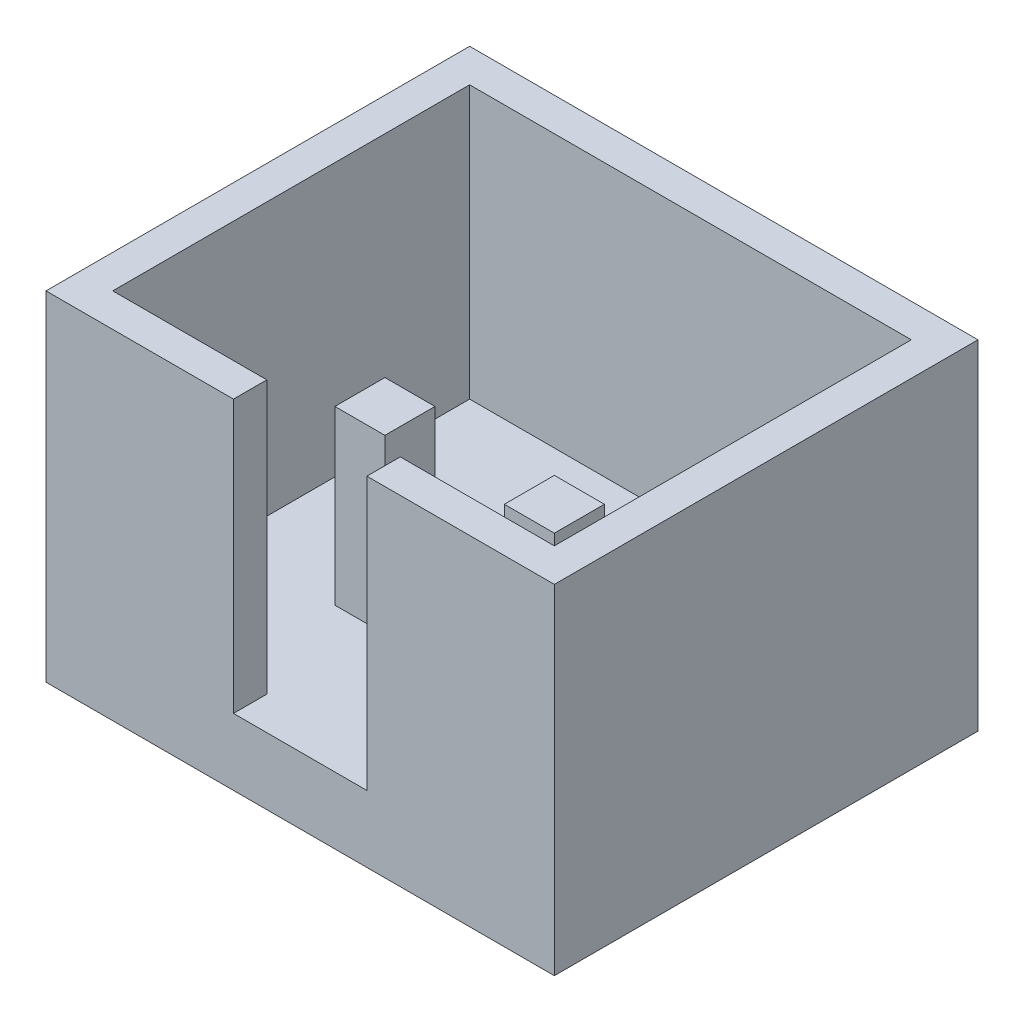
ISO-10303-21;
HEADER;
FILE_DESCRIPTION(('STEP AP214'),'2;1');
FILE_NAME('part.step','',(''),(''),'','','');
FILE_SCHEMA(('AUTOMOTIVE_DESIGN { 1 0 10303 214 1 1 1 1 }'));
ENDSEC;
DATA;
#1=APPLICATION_CONTEXT('core data for automotive mechanical design processes');
#2=APPLICATION_PROTOCOL_DEFINITION('international standard','automotive_design',2000,#1);
#3=PRODUCT_CONTEXT('',#1,'mechanical');
#4=PRODUCT('Part','Part','',(#3));
#5=PRODUCT_RELATED_PRODUCT_CATEGORY('part','',(#4));
#6=PRODUCT_DEFINITION_FORMATION('','',#4);
#7=PRODUCT_DEFINITION_CONTEXT('part definition',#1,'design');
#8=PRODUCT_DEFINITION('design','',#6,#7);
#9=PRODUCT_DEFINITION_SHAPE('','',#8);
#10=(LENGTH_UNIT() NAMED_UNIT(*) SI_UNIT(.MILLI.,.METRE.));
#11=(NAMED_UNIT(*) PLANE_ANGLE_UNIT() SI_UNIT($,.RADIAN.));
#12=(NAMED_UNIT(*) SI_UNIT($,.STERADIAN.) SOLID_ANGLE_UNIT());
#13=UNCERTAINTY_MEASURE_WITH_UNIT(LENGTH_MEASURE(1.E-05),#10,'distance_accuracy_value','');
#14=(GEOMETRIC_REPRESENTATION_CONTEXT(3) GLOBAL_UNCERTAINTY_ASSIGNED_CONTEXT((#13)) GLOBAL_UNIT_ASSIGNED_CONTEXT((#10,
#11,#12)) REPRESENTATION_CONTEXT('',''));
#15=CARTESIAN_POINT('',(0.,0.,0.));
#16=DIRECTION('',(0.,0.,1.));
#17=DIRECTION('',(1.,0.,0.));
#18=AXIS2_PLACEMENT_3D('',#15,#16,#17);
#19=CARTESIAN_POINT('',(-3.81,0.,3.175));
#20=DIRECTION('',(0.,1.,0.));
#21=DIRECTION('',(0.,0.,1.));
#22=AXIS2_PLACEMENT_3D('',#19,#20,#21);
#23=PLANE('',#22);
#24=DIRECTION('',(0.,0.,-1.));
#25=VECTOR('',#24,1.);
#26=CARTESIAN_POINT('',(-1.645,0.,3.175));
#27=LINE('',#26,#25);
#28=CARTESIAN_POINT('',(-1.645,0.,1.01));
#29=VERTEX_POINT('',#28);
#30=CARTESIAN_POINT('',(-1.645,0.,0.259999999999998));
#31=VERTEX_POINT('',#30);
#32=EDGE_CURVE('E321',#29,#31,#27,.T.);
#33=ORIENTED_EDGE('',*,*,#32,.F.);
#34=DIRECTION('',(-1.,0.,0.));
#35=VECTOR('',#34,1.);
#36=CARTESIAN_POINT('',(-3.81,0.,1.01));
#37=LINE('',#36,#35);
#38=CARTESIAN_POINT('',(-0.895,0.,1.01));
#39=VERTEX_POINT('',#38);
#40=EDGE_CURVE('E312',#39,#29,#37,.T.);
#41=ORIENTED_EDGE('',*,*,#40,.F.);
#42=DIRECTION('',(0.,0.,1.));
#43=VECTOR('',#42,1.);
#44=CARTESIAN_POINT('',(-0.894999999999996,0.,3.17499999999999));
#45=LINE('',#44,#43);
#46=CARTESIAN_POINT('',(-0.895000000000001,0.,0.259999999999998));
#47=VERTEX_POINT('',#46);
#48=EDGE_CURVE('E315',#47,#39,#45,.T.);
#49=ORIENTED_EDGE('',*,*,#48,.F.);
#50=DIRECTION('',(1.,0.,0.));
#51=VECTOR('',#50,1.);
#52=CARTESIAN_POINT('',(-3.81,0.,0.259999999999998));
#53=LINE('',#52,#51);
#54=EDGE_CURVE('E318',#31,#47,#53,.T.);
#55=ORIENTED_EDGE('',*,*,#54,.F.);
#56=EDGE_LOOP('',(#33,#41,#49,#55));
#57=FACE_BOUND('',#56,.T.);
#58=DIRECTION('',(0.,0.,1.));
#59=VECTOR('',#58,1.);
#60=CARTESIAN_POINT('',(-3.81,0.,-3.175));
#61=LINE('',#60,#59);
#62=CARTESIAN_POINT('',(-3.81,0.,-3.175));
#63=VERTEX_POINT('',#62);
#64=CARTESIAN_POINT('',(-3.81,0.,3.175));
#65=VERTEX_POINT('',#64);
#66=EDGE_CURVE('E379',#63,#65,#61,.T.);
#67=ORIENTED_EDGE('',*,*,#66,.F.);
#68=DIRECTION('',(-1.,0.,0.));
#69=VECTOR('',#68,1.);
#70=CARTESIAN_POINT('',(-3.81,0.,-3.175));
#71=LINE('',#70,#69);
#72=CARTESIAN_POINT('',(3.81,0.,-3.175));
#73=VERTEX_POINT('',#72);
#74=EDGE_CURVE('E386',#73,#63,#71,.T.);
#75=ORIENTED_EDGE('',*,*,#74,.F.);
#76=DIRECTION('',(0.,0.,-1.));
#77=VECTOR('',#76,1.);
#78=CARTESIAN_POINT('',(3.81,0.,-3.175));
#79=LINE('',#78,#77);
#80=CARTESIAN_POINT('',(3.81,0.,3.175));
#81=VERTEX_POINT('',#80);
#82=EDGE_CURVE('E384',#81,#73,#79,.T.);
#83=ORIENTED_EDGE('',*,*,#82,.F.);
#84=DIRECTION('',(1.,0.,0.));
#85=VECTOR('',#84,1.);
#86=CARTESIAN_POINT('',(-3.81,0.,3.175));
#87=LINE('',#86,#85);
#88=EDGE_CURVE('E382',#65,#81,#87,.T.);
#89=ORIENTED_EDGE('',*,*,#88,.F.);
#90=EDGE_LOOP('',(#67,#75,#83,#89));
#91=FACE_BOUND('',#90,.T.);
#92=DIRECTION('',(0.,0.,-1.));
#93=VECTOR('',#92,1.);
#94=CARTESIAN_POINT('',(0.895,0.,3.175));
#95=LINE('',#94,#93);
#96=CARTESIAN_POINT('',(0.895000000000001,0.,1.01));
#97=VERTEX_POINT('',#96);
#98=CARTESIAN_POINT('',(0.895000000000002,0.,0.259999999999998));
#99=VERTEX_POINT('',#98);
#100=EDGE_CURVE('E273',#97,#99,#95,.T.);
#101=ORIENTED_EDGE('',*,*,#100,.F.);
#102=DIRECTION('',(-1.,0.,0.));
#103=VECTOR('',#102,1.);
#104=CARTESIAN_POINT('',(-3.81,0.,1.01));
#105=LINE('',#104,#103);
#106=CARTESIAN_POINT('',(1.645,0.,1.01));
#107=VERTEX_POINT('',#106);
#108=EDGE_CURVE('E268',#107,#97,#105,.T.);
#109=ORIENTED_EDGE('',*,*,#108,.F.);
#110=DIRECTION('',(0.,0.,1.));
#111=VECTOR('',#110,1.);
#112=CARTESIAN_POINT('',(1.645,0.,3.17499999999999));
#113=LINE('',#112,#111);
#114=CARTESIAN_POINT('',(1.645,0.,0.259999999999998));
#115=VERTEX_POINT('',#114);
#116=EDGE_CURVE('E54',#115,#107,#113,.T.);
#117=ORIENTED_EDGE('',*,*,#116,.F.);
#118=DIRECTION('',(1.,0.,0.));
#119=VECTOR('',#118,1.);
#120=CARTESIAN_POINT('',(-3.81,0.,0.259999999999997));
#121=LINE('',#120,#119);
#122=EDGE_CURVE('E49',#99,#115,#121,.T.);
#123=ORIENTED_EDGE('',*,*,#122,.F.);
#124=EDGE_LOOP('',(#101,#109,#117,#123));
#125=FACE_BOUND('',#124,.T.);
#126=ADVANCED_FACE('F34',(#57,#91,#125),#23,.F.);
#127=CARTESIAN_POINT('',(-3.81,1.,3.175));
#128=DIRECTION('',(0.,1.,0.));
#129=DIRECTION('',(0.,0.,1.));
#130=AXIS2_PLACEMENT_3D('',#127,#128,#129);
#131=PLANE('',#130);
#132=DIRECTION('',(-1.,0.,0.));
#133=VECTOR('',#132,1.);
#134=CARTESIAN_POINT('',(-3.81,1.,1.01));
#135=LINE('',#134,#133);
#136=CARTESIAN_POINT('',(-0.895,1.,1.01));
#137=VERTEX_POINT('',#136);
#138=CARTESIAN_POINT('',(-1.645,1.,1.01));
#139=VERTEX_POINT('',#138);
#140=EDGE_CURVE('E411',#137,#139,#135,.T.);
#141=ORIENTED_EDGE('',*,*,#140,.T.);
#142=DIRECTION('',(0.,0.,-1.));
#143=VECTOR('',#142,1.);
#144=CARTESIAN_POINT('',(-1.645,1.,3.175));
#145=LINE('',#144,#143);
#146=CARTESIAN_POINT('',(-1.645,1.,0.259999999999998));
#147=VERTEX_POINT('',#146);
#148=EDGE_CURVE('E420',#139,#147,#145,.T.);
#149=ORIENTED_EDGE('',*,*,#148,.T.);
#150=DIRECTION('',(1.,0.,0.));
#151=VECTOR('',#150,1.);
#152=CARTESIAN_POINT('',(-3.81,1.,0.259999999999998));
#153=LINE('',#152,#151);
#154=CARTESIAN_POINT('',(-0.895000000000001,1.,0.259999999999998));
#155=VERTEX_POINT('',#154);
#156=EDGE_CURVE('E417',#147,#155,#153,.T.);
#157=ORIENTED_EDGE('',*,*,#156,.T.);
#158=DIRECTION('',(0.,0.,1.));
#159=VECTOR('',#158,1.);
#160=CARTESIAN_POINT('',(-0.894999999999996,1.,3.17499999999999));
#161=LINE('',#160,#159);
#162=EDGE_CURVE('E414',#155,#137,#161,.T.);
#163=ORIENTED_EDGE('',*,*,#162,.T.);
#164=EDGE_LOOP('',(#141,#149,#157,#163));
#165=FACE_BOUND('',#164,.T.);
#166=DIRECTION('',(-1.,0.,0.));
#167=VECTOR('',#166,1.);
#168=CARTESIAN_POINT('',(-3.31,1.,2.675));
#169=LINE('',#168,#167);
#170=CARTESIAN_POINT('',(-0.999999999999999,1.,2.675));
#171=VERTEX_POINT('',#170);
#172=CARTESIAN_POINT('',(-3.31,1.,2.675));
#173=VERTEX_POINT('',#172);
#174=EDGE_CURVE('E352',#171,#173,#169,.T.);
#175=ORIENTED_EDGE('',*,*,#174,.F.);
#176=DIRECTION('',(0.,0.,1.));
#177=VECTOR('',#176,1.);
#178=CARTESIAN_POINT('',(-0.999999999999999,1.,2.175));
#179=LINE('',#178,#177);
#180=CARTESIAN_POINT('',(-0.999999999999999,1.,3.175));
#181=VERTEX_POINT('',#180);
#182=EDGE_CURVE('E332',#171,#181,#179,.T.);
#183=ORIENTED_EDGE('',*,*,#182,.T.);
#184=DIRECTION('',(1.,0.,0.));
#185=VECTOR('',#184,1.);
#186=CARTESIAN_POINT('',(-0.999999999999999,1.,3.175));
#187=LINE('',#186,#185);
#188=CARTESIAN_POINT('',(1.,1.,3.175));
#189=VERTEX_POINT('',#188);
#190=EDGE_CURVE('E327',#181,#189,#187,.T.);
#191=ORIENTED_EDGE('',*,*,#190,.T.);
#192=DIRECTION('',(0.,0.,1.));
#193=VECTOR('',#192,1.);
#194=CARTESIAN_POINT('',(1.,1.,2.175));
#195=LINE('',#194,#193);
#196=CARTESIAN_POINT('',(1.,1.,2.675));
#197=VERTEX_POINT('',#196);
#198=EDGE_CURVE('E339',#197,#189,#195,.T.);
#199=ORIENTED_EDGE('',*,*,#198,.F.);
#200=CARTESIAN_POINT('',(3.31,1.,2.675));
#201=VERTEX_POINT('',#200);
#202=EDGE_CURVE('E348',#201,#197,#169,.T.);
#203=ORIENTED_EDGE('',*,*,#202,.F.);
#204=DIRECTION('',(0.,0.,1.));
#205=VECTOR('',#204,1.);
#206=CARTESIAN_POINT('',(3.31,1.,2.675));
#207=LINE('',#206,#205);
#208=CARTESIAN_POINT('',(3.31,1.,-2.675));
#209=VERTEX_POINT('',#208);
#210=EDGE_CURVE('E351',#209,#201,#207,.T.);
#211=ORIENTED_EDGE('',*,*,#210,.F.);
#212=DIRECTION('',(1.,0.,0.));
#213=VECTOR('',#212,1.);
#214=CARTESIAN_POINT('',(3.31,1.,-2.675));
#215=LINE('',#214,#213);
#216=CARTESIAN_POINT('',(-3.31,1.,-2.675));
#217=VERTEX_POINT('',#216);
#218=EDGE_CURVE('E354',#217,#209,#215,.T.);
#219=ORIENTED_EDGE('',*,*,#218,.F.);
#220=DIRECTION('',(0.,0.,-1.));
#221=VECTOR('',#220,1.);
#222=CARTESIAN_POINT('',(-3.31,1.,-2.675));
#223=LINE('',#222,#221);
#224=EDGE_CURVE('E356',#173,#217,#223,.T.);
#225=ORIENTED_EDGE('',*,*,#224,.F.);
#226=EDGE_LOOP('',(#175,#183,#191,#199,#203,#211,#219,#225));
#227=FACE_BOUND('',#226,.T.);
#228=DIRECTION('',(-1.,0.,0.));
#229=VECTOR('',#228,1.);
#230=CARTESIAN_POINT('',(-3.81,1.,1.01));
#231=LINE('',#230,#229);
#232=CARTESIAN_POINT('',(1.645,1.,1.01));
#233=VERTEX_POINT('',#232);
#234=CARTESIAN_POINT('',(0.895000000000001,1.,1.01));
#235=VERTEX_POINT('',#234);
#236=EDGE_CURVE('E423',#233,#235,#231,.T.);
#237=ORIENTED_EDGE('',*,*,#236,.T.);
#238=DIRECTION('',(0.,0.,-1.));
#239=VECTOR('',#238,1.);
#240=CARTESIAN_POINT('',(0.895,1.,3.175));
#241=LINE('',#240,#239);
#242=CARTESIAN_POINT('',(0.895000000000002,1.,0.259999999999998));
#243=VERTEX_POINT('',#242);
#244=EDGE_CURVE('E12',#235,#243,#241,.T.);
#245=ORIENTED_EDGE('',*,*,#244,.T.);
#246=DIRECTION('',(1.,0.,0.));
#247=VECTOR('',#246,1.);
#248=CARTESIAN_POINT('',(-3.81,1.,0.259999999999997));
#249=LINE('',#248,#247);
#250=CARTESIAN_POINT('',(1.645,1.,0.259999999999998));
#251=VERTEX_POINT('',#250);
#252=EDGE_CURVE('E42',#243,#251,#249,.T.);
#253=ORIENTED_EDGE('',*,*,#252,.T.);
#254=DIRECTION('',(0.,0.,1.));
#255=VECTOR('',#254,1.);
#256=CARTESIAN_POINT('',(1.645,1.,3.17499999999999));
#257=LINE('',#256,#255);
#258=EDGE_CURVE('E223',#251,#233,#257,.T.);
#259=ORIENTED_EDGE('',*,*,#258,.T.);
#260=EDGE_LOOP('',(#237,#245,#253,#259));
#261=FACE_BOUND('',#260,.T.);
#262=ADVANCED_FACE('F427',(#165,#227,#261),#131,.T.);
#263=CARTESIAN_POINT('',(-3.31,-8.51157447244633,2.675));
#264=DIRECTION('',(0.,0.,1.));
#265=DIRECTION('',(1.,0.,0.));
#266=AXIS2_PLACEMENT_3D('',#263,#264,#265);
#267=PLANE('',#266);
#268=DIRECTION('',(1.,0.,0.));
#269=VECTOR('',#268,1.);
#270=CARTESIAN_POINT('',(-3.31,5.08,2.675));
#271=LINE('',#270,#269);
#272=CARTESIAN_POINT('',(-3.31,5.08,2.675));
#273=VERTEX_POINT('',#272);
#274=CARTESIAN_POINT('',(-1.,5.08,2.675));
#275=VERTEX_POINT('',#274);
#276=EDGE_CURVE('E362',#273,#275,#271,.T.);
#277=ORIENTED_EDGE('',*,*,#276,.T.);
#278=DIRECTION('',(0.,-1.,0.));
#279=VECTOR('',#278,1.);
#280=CARTESIAN_POINT('',(-0.999999999999998,-8.51157447244633,2.675));
#281=LINE('',#280,#279);
#282=EDGE_CURVE('E344',#275,#171,#281,.T.);
#283=ORIENTED_EDGE('',*,*,#282,.T.);
#284=ORIENTED_EDGE('',*,*,#174,.T.);
#285=DIRECTION('',(0.,1.,0.));
#286=VECTOR('',#285,1.);
#287=CARTESIAN_POINT('',(-3.31,-8.51157447244633,2.675));
#288=LINE('',#287,#286);
#289=EDGE_CURVE('E374',#173,#273,#288,.T.);
#290=ORIENTED_EDGE('',*,*,#289,.T.);
#291=EDGE_LOOP('',(#277,#283,#284,#290));
#292=FACE_BOUND('',#291,.T.);
#293=ADVANCED_FACE('F454',(#292),#267,.F.);
#294=CARTESIAN_POINT('',(-3.81,5.08,-3.175));
#295=DIRECTION('',(1.,0.,0.));
#296=DIRECTION('',(0.,0.,-1.));
#297=AXIS2_PLACEMENT_3D('',#294,#295,#296);
#298=PLANE('',#297);
#299=ORIENTED_EDGE('',*,*,#66,.T.);
#300=DIRECTION('',(0.,-1.,0.));
#301=VECTOR('',#300,1.);
#302=CARTESIAN_POINT('',(-3.81,5.08,3.175));
#303=LINE('',#302,#301);
#304=CARTESIAN_POINT('',(-3.81,5.08,3.175));
#305=VERTEX_POINT('',#304);
#306=EDGE_CURVE('E408',#305,#65,#303,.T.);
#307=ORIENTED_EDGE('',*,*,#306,.F.);
#308=DIRECTION('',(0.,0.,1.));
#309=VECTOR('',#308,1.);
#310=CARTESIAN_POINT('',(-3.81,5.08,-3.175));
#311=LINE('',#310,#309);
#312=CARTESIAN_POINT('',(-3.81,5.08,-3.175));
#313=VERTEX_POINT('',#312);
#314=EDGE_CURVE('E388',#313,#305,#311,.T.);
#315=ORIENTED_EDGE('',*,*,#314,.F.);
#316=DIRECTION('',(0.,-1.,0.));
#317=VECTOR('',#316,1.);
#318=CARTESIAN_POINT('',(-3.81,5.08,-3.175));
#319=LINE('',#318,#317);
#320=EDGE_CURVE('E399',#313,#63,#319,.T.);
#321=ORIENTED_EDGE('',*,*,#320,.T.);
#322=EDGE_LOOP('',(#299,#307,#315,#321));
#323=FACE_BOUND('',#322,.T.);
#324=ADVANCED_FACE('F36',(#323),#298,.F.);
#325=CARTESIAN_POINT('',(-3.81,5.08,3.175));
#326=DIRECTION('',(0.,0.,-1.));
#327=DIRECTION('',(-1.,0.,0.));
#328=AXIS2_PLACEMENT_3D('',#325,#326,#327);
#329=PLANE('',#328);
#330=ORIENTED_EDGE('',*,*,#190,.F.);
#331=DIRECTION('',(0.,-1.,0.));
#332=VECTOR('',#331,1.);
#333=CARTESIAN_POINT('',(-1.,5.08,3.175));
#334=LINE('',#333,#332);
#335=CARTESIAN_POINT('',(-1.,5.08,3.175));
#336=VERTEX_POINT('',#335);
#337=EDGE_CURVE('E324',#336,#181,#334,.T.);
#338=ORIENTED_EDGE('',*,*,#337,.F.);
#339=DIRECTION('',(1.,0.,0.));
#340=VECTOR('',#339,1.);
#341=CARTESIAN_POINT('',(-3.81,5.08,3.175));
#342=LINE('',#341,#340);
#343=EDGE_CURVE('E392',#305,#336,#342,.T.);
#344=ORIENTED_EDGE('',*,*,#343,.F.);
#345=ORIENTED_EDGE('',*,*,#306,.T.);
#346=ORIENTED_EDGE('',*,*,#88,.T.);
#347=DIRECTION('',(0.,-1.,0.));
#348=VECTOR('',#347,1.);
#349=CARTESIAN_POINT('',(3.81,5.08,3.175));
#350=LINE('',#349,#348);
#351=CARTESIAN_POINT('',(3.81,5.08,3.175));
#352=VERTEX_POINT('',#351);
#353=EDGE_CURVE('E405',#352,#81,#350,.T.);
#354=ORIENTED_EDGE('',*,*,#353,.F.);
#355=CARTESIAN_POINT('',(1.,5.08,3.175));
#356=VERTEX_POINT('',#355);
#357=EDGE_CURVE('E391',#356,#352,#342,.T.);
#358=ORIENTED_EDGE('',*,*,#357,.F.);
#359=DIRECTION('',(0.,1.,0.));
#360=VECTOR('',#359,1.);
#361=CARTESIAN_POINT('',(1.,5.08,3.175));
#362=LINE('',#361,#360);
#363=EDGE_CURVE('E330',#189,#356,#362,.T.);
#364=ORIENTED_EDGE('',*,*,#363,.F.);
#365=EDGE_LOOP('',(#330,#338,#344,#345,#346,#354,#358,#364));
#366=FACE_BOUND('',#365,.T.);
#367=ADVANCED_FACE('F472',(#366),#329,.F.);
#368=CARTESIAN_POINT('',(3.81,5.08,-3.175));
#369=DIRECTION('',(-1.,0.,0.));
#370=DIRECTION('',(0.,0.,1.));
#371=AXIS2_PLACEMENT_3D('',#368,#369,#370);
#372=PLANE('',#371);
#373=ORIENTED_EDGE('',*,*,#82,.T.);
#374=DIRECTION('',(0.,-1.,0.));
#375=VECTOR('',#374,1.);
#376=CARTESIAN_POINT('',(3.81,5.08,-3.175));
#377=LINE('',#376,#375);
#378=CARTESIAN_POINT('',(3.81,5.08,-3.175));
#379=VERTEX_POINT('',#378);
#380=EDGE_CURVE('E402',#379,#73,#377,.T.);
#381=ORIENTED_EDGE('',*,*,#380,.F.);
#382=DIRECTION('',(0.,0.,-1.));
#383=VECTOR('',#382,1.);
#384=CARTESIAN_POINT('',(3.81,5.08,-3.175));
#385=LINE('',#384,#383);
#386=EDGE_CURVE('E395',#352,#379,#385,.T.);
#387=ORIENTED_EDGE('',*,*,#386,.F.);
#388=ORIENTED_EDGE('',*,*,#353,.T.);
#389=EDGE_LOOP('',(#373,#381,#387,#388));
#390=FACE_BOUND('',#389,.T.);
#391=ADVANCED_FACE('F469',(#390),#372,.F.);
#392=CARTESIAN_POINT('',(-3.81,5.08,-3.175));
#393=DIRECTION('',(0.,0.,1.));
#394=DIRECTION('',(1.,0.,0.));
#395=AXIS2_PLACEMENT_3D('',#392,#393,#394);
#396=PLANE('',#395);
#397=ORIENTED_EDGE('',*,*,#74,.T.);
#398=ORIENTED_EDGE('',*,*,#320,.F.);
#399=DIRECTION('',(-1.,0.,0.));
#400=VECTOR('',#399,1.);
#401=CARTESIAN_POINT('',(-3.81,5.08,-3.175));
#402=LINE('',#401,#400);
#403=EDGE_CURVE('E397',#379,#313,#402,.T.);
#404=ORIENTED_EDGE('',*,*,#403,.F.);
#405=ORIENTED_EDGE('',*,*,#380,.T.);
#406=EDGE_LOOP('',(#397,#398,#404,#405));
#407=FACE_BOUND('',#406,.T.);
#408=ADVANCED_FACE('F465',(#407),#396,.F.);
#409=CARTESIAN_POINT('',(-3.81,5.08,3.175));
#410=DIRECTION('',(0.,1.,0.));
#411=DIRECTION('',(0.,0.,1.));
#412=AXIS2_PLACEMENT_3D('',#409,#410,#411);
#413=PLANE('',#412);
#414=DIRECTION('',(0.,0.,1.));
#415=VECTOR('',#414,1.);
#416=CARTESIAN_POINT('',(-1.,5.08,2.175));
#417=LINE('',#416,#415);
#418=EDGE_CURVE('E333',#275,#336,#417,.T.);
#419=ORIENTED_EDGE('',*,*,#418,.F.);
#420=ORIENTED_EDGE('',*,*,#276,.F.);
#421=DIRECTION('',(0.,0.,1.));
#422=VECTOR('',#421,1.);
#423=CARTESIAN_POINT('',(-3.31,5.08,-2.675));
#424=LINE('',#423,#422);
#425=CARTESIAN_POINT('',(-3.31,5.08,-2.675));
#426=VERTEX_POINT('',#425);
#427=EDGE_CURVE('E358',#426,#273,#424,.T.);
#428=ORIENTED_EDGE('',*,*,#427,.F.);
#429=DIRECTION('',(-1.,0.,0.));
#430=VECTOR('',#429,1.);
#431=CARTESIAN_POINT('',(3.31,5.08,-2.675));
#432=LINE('',#431,#430);
#433=CARTESIAN_POINT('',(3.31,5.08,-2.675));
#434=VERTEX_POINT('',#433);
#435=EDGE_CURVE('E347',#434,#426,#432,.T.);
#436=ORIENTED_EDGE('',*,*,#435,.F.);
#437=DIRECTION('',(0.,0.,-1.));
#438=VECTOR('',#437,1.);
#439=CARTESIAN_POINT('',(3.31,5.08,2.675));
#440=LINE('',#439,#438);
#441=CARTESIAN_POINT('',(3.31,5.08,2.675));
#442=VERTEX_POINT('',#441);
#443=EDGE_CURVE('E365',#442,#434,#440,.T.);
#444=ORIENTED_EDGE('',*,*,#443,.F.);
#445=CARTESIAN_POINT('',(1.,5.08,2.675));
#446=VERTEX_POINT('',#445);
#447=EDGE_CURVE('E361',#446,#442,#271,.T.);
#448=ORIENTED_EDGE('',*,*,#447,.F.);
#449=DIRECTION('',(0.,0.,1.));
#450=VECTOR('',#449,1.);
#451=CARTESIAN_POINT('',(1.,5.08,2.175));
#452=LINE('',#451,#450);
#453=EDGE_CURVE('E336',#446,#356,#452,.T.);
#454=ORIENTED_EDGE('',*,*,#453,.T.);
#455=ORIENTED_EDGE('',*,*,#357,.T.);
#456=ORIENTED_EDGE('',*,*,#386,.T.);
#457=ORIENTED_EDGE('',*,*,#403,.T.);
#458=ORIENTED_EDGE('',*,*,#314,.T.);
#459=ORIENTED_EDGE('',*,*,#343,.T.);
#460=EDGE_LOOP('',(#419,#420,#428,#436,#444,#448,#454,#455,#456,#457,#458,#459));
#461=FACE_BOUND('',#460,.T.);
#462=ADVANCED_FACE('F462',(#461),#413,.T.);
#463=CARTESIAN_POINT('',(3.31,-8.51157447244633,-2.675));
#464=DIRECTION('',(0.,0.,-1.));
#465=DIRECTION('',(-1.,0.,0.));
#466=AXIS2_PLACEMENT_3D('',#463,#464,#465);
#467=PLANE('',#466);
#468=ORIENTED_EDGE('',*,*,#218,.T.);
#469=DIRECTION('',(0.,1.,0.));
#470=VECTOR('',#469,1.);
#471=CARTESIAN_POINT('',(3.31,-8.51157447244633,-2.675));
#472=LINE('',#471,#470);
#473=EDGE_CURVE('E369',#209,#434,#472,.T.);
#474=ORIENTED_EDGE('',*,*,#473,.T.);
#475=ORIENTED_EDGE('',*,*,#435,.T.);
#476=DIRECTION('',(0.,1.,0.));
#477=VECTOR('',#476,1.);
#478=CARTESIAN_POINT('',(-3.31,-8.51157447244633,-2.675));
#479=LINE('',#478,#477);
#480=EDGE_CURVE('E368',#217,#426,#479,.T.);
#481=ORIENTED_EDGE('',*,*,#480,.F.);
#482=EDGE_LOOP('',(#468,#474,#475,#481));
#483=FACE_BOUND('',#482,.T.);
#484=ADVANCED_FACE('F460',(#483),#467,.F.);
#485=CARTESIAN_POINT('',(3.31,-8.51157447244633,2.675));
#486=DIRECTION('',(1.,0.,0.));
#487=DIRECTION('',(0.,0.,-1.));
#488=AXIS2_PLACEMENT_3D('',#485,#486,#487);
#489=PLANE('',#488);
#490=ORIENTED_EDGE('',*,*,#210,.T.);
#491=DIRECTION('',(0.,1.,0.));
#492=VECTOR('',#491,1.);
#493=CARTESIAN_POINT('',(3.31,-8.51157447244633,2.675));
#494=LINE('',#493,#492);
#495=EDGE_CURVE('E371',#201,#442,#494,.T.);
#496=ORIENTED_EDGE('',*,*,#495,.T.);
#497=ORIENTED_EDGE('',*,*,#443,.T.);
#498=ORIENTED_EDGE('',*,*,#473,.F.);
#499=EDGE_LOOP('',(#490,#496,#497,#498));
#500=FACE_BOUND('',#499,.T.);
#501=ADVANCED_FACE('F507',(#500),#489,.F.);
#502=ORIENTED_EDGE('',*,*,#202,.T.);
#503=DIRECTION('',(0.,1.,0.));
#504=VECTOR('',#503,1.);
#505=CARTESIAN_POINT('',(0.999999999999998,-8.51157447244633,2.675));
#506=LINE('',#505,#504);
#507=EDGE_CURVE('E335',#197,#446,#506,.T.);
#508=ORIENTED_EDGE('',*,*,#507,.T.);
#509=ORIENTED_EDGE('',*,*,#447,.T.);
#510=ORIENTED_EDGE('',*,*,#495,.F.);
#511=EDGE_LOOP('',(#502,#508,#509,#510));
#512=FACE_BOUND('',#511,.T.);
#513=ADVANCED_FACE('F510',(#512),#267,.F.);
#514=CARTESIAN_POINT('',(-3.31,-8.51157447244633,-2.675));
#515=DIRECTION('',(-1.,0.,0.));
#516=DIRECTION('',(0.,0.,1.));
#517=AXIS2_PLACEMENT_3D('',#514,#515,#516);
#518=PLANE('',#517);
#519=ORIENTED_EDGE('',*,*,#224,.T.);
#520=ORIENTED_EDGE('',*,*,#480,.T.);
#521=ORIENTED_EDGE('',*,*,#427,.T.);
#522=ORIENTED_EDGE('',*,*,#289,.F.);
#523=EDGE_LOOP('',(#519,#520,#521,#522));
#524=FACE_BOUND('',#523,.T.);
#525=ADVANCED_FACE('F497',(#524),#518,.F.);
#526=CARTESIAN_POINT('',(-1.,5.08,2.175));
#527=DIRECTION('',(-1.,0.,0.));
#528=DIRECTION('',(0.,-1.,0.));
#529=AXIS2_PLACEMENT_3D('',#526,#527,#528);
#530=PLANE('',#529);
#531=ORIENTED_EDGE('',*,*,#418,.T.);
#532=ORIENTED_EDGE('',*,*,#337,.T.);
#533=ORIENTED_EDGE('',*,*,#182,.F.);
#534=ORIENTED_EDGE('',*,*,#282,.F.);
#535=EDGE_LOOP('',(#531,#532,#533,#534));
#536=FACE_BOUND('',#535,.T.);
#537=ADVANCED_FACE('F490',(#536),#530,.F.);
#538=CARTESIAN_POINT('',(1.,5.08,2.175));
#539=DIRECTION('',(1.,0.,0.));
#540=DIRECTION('',(0.,1.,0.));
#541=AXIS2_PLACEMENT_3D('',#538,#539,#540);
#542=PLANE('',#541);
#543=ORIENTED_EDGE('',*,*,#198,.T.);
#544=ORIENTED_EDGE('',*,*,#363,.T.);
#545=ORIENTED_EDGE('',*,*,#453,.F.);
#546=ORIENTED_EDGE('',*,*,#507,.F.);
#547=EDGE_LOOP('',(#543,#544,#545,#546));
#548=FACE_BOUND('',#547,.T.);
#549=ADVANCED_FACE('F553',(#548),#542,.F.);
#550=CARTESIAN_POINT('',(-3.81,3.58,3.175));
#551=DIRECTION('',(0.,1.,0.));
#552=DIRECTION('',(0.,0.,1.));
#553=AXIS2_PLACEMENT_3D('',#550,#551,#552);
#554=PLANE('',#553);
#555=DIRECTION('',(0.,0.,-1.));
#556=VECTOR('',#555,1.);
#557=CARTESIAN_POINT('',(-1.645,3.58,1.01));
#558=LINE('',#557,#556);
#559=CARTESIAN_POINT('',(-1.645,3.58,1.01));
#560=VERTEX_POINT('',#559);
#561=CARTESIAN_POINT('',(-1.645,3.58,0.259999999999998));
#562=VERTEX_POINT('',#561);
#563=EDGE_CURVE('E279',#560,#562,#558,.T.);
#564=ORIENTED_EDGE('',*,*,#563,.F.);
#565=DIRECTION('',(-1.,0.,0.));
#566=VECTOR('',#565,1.);
#567=CARTESIAN_POINT('',(-1.645,3.58,1.01));
#568=LINE('',#567,#566);
#569=CARTESIAN_POINT('',(-0.895,3.58,1.01));
#570=VERTEX_POINT('',#569);
#571=EDGE_CURVE('E283',#570,#560,#568,.T.);
#572=ORIENTED_EDGE('',*,*,#571,.F.);
#573=DIRECTION('',(0.,0.,1.));
#574=VECTOR('',#573,1.);
#575=CARTESIAN_POINT('',(-0.895,3.58,1.01));
#576=LINE('',#575,#574);
#577=CARTESIAN_POINT('',(-0.895000000000001,3.58,0.259999999999998));
#578=VERTEX_POINT('',#577);
#579=EDGE_CURVE('E278',#578,#570,#576,.T.);
#580=ORIENTED_EDGE('',*,*,#579,.F.);
#581=DIRECTION('',(1.,0.,0.));
#582=VECTOR('',#581,1.);
#583=CARTESIAN_POINT('',(-1.645,3.58,0.259999999999998));
#584=LINE('',#583,#582);
#585=EDGE_CURVE('E275',#562,#578,#584,.T.);
#586=ORIENTED_EDGE('',*,*,#585,.F.);
#587=EDGE_LOOP('',(#564,#572,#580,#586));
#588=FACE_BOUND('',#587,.T.);
#589=ADVANCED_FACE('F549',(#588),#554,.T.);
#590=CARTESIAN_POINT('',(-1.645,-2.,1.01));
#591=DIRECTION('',(0.,0.,-1.));
#592=DIRECTION('',(-1.,0.,0.));
#593=AXIS2_PLACEMENT_3D('',#590,#591,#592);
#594=PLANE('',#593);
#595=ORIENTED_EDGE('',*,*,#140,.F.);
#596=DIRECTION('',(0.,1.,0.));
#597=VECTOR('',#596,1.);
#598=CARTESIAN_POINT('',(-0.895,-2.,1.01));
#599=LINE('',#598,#597);
#600=EDGE_CURVE('E300',#137,#570,#599,.T.);
#601=ORIENTED_EDGE('',*,*,#600,.T.);
#602=ORIENTED_EDGE('',*,*,#571,.T.);
#603=DIRECTION('',(0.,1.,0.));
#604=VECTOR('',#603,1.);
#605=CARTESIAN_POINT('',(-1.645,-2.,1.01));
#606=LINE('',#605,#604);
#607=EDGE_CURVE('E296',#139,#560,#606,.T.);
#608=ORIENTED_EDGE('',*,*,#607,.F.);
#609=EDGE_LOOP('',(#595,#601,#602,#608));
#610=FACE_BOUND('',#609,.T.);
#611=ADVANCED_FACE('F552',(#610),#594,.F.);
#612=CARTESIAN_POINT('',(-0.895,-2.,1.01));
#613=DIRECTION('',(-1.,0.,0.));
#614=DIRECTION('',(0.,0.,1.));
#615=AXIS2_PLACEMENT_3D('',#612,#613,#614);
#616=PLANE('',#615);
#617=ORIENTED_EDGE('',*,*,#162,.F.);
#618=DIRECTION('',(0.,1.,0.));
#619=VECTOR('',#618,1.);
#620=CARTESIAN_POINT('',(-0.895000000000001,-2.,0.259999999999998));
#621=LINE('',#620,#619);
#622=EDGE_CURVE('E304',#155,#578,#621,.T.);
#623=ORIENTED_EDGE('',*,*,#622,.T.);
#624=ORIENTED_EDGE('',*,*,#579,.T.);
#625=ORIENTED_EDGE('',*,*,#600,.F.);
#626=EDGE_LOOP('',(#617,#623,#624,#625));
#627=FACE_BOUND('',#626,.T.);
#628=ADVANCED_FACE('F561',(#627),#616,.F.);
#629=CARTESIAN_POINT('',(-1.645,-2.,0.259999999999998));
#630=DIRECTION('',(0.,0.,1.));
#631=DIRECTION('',(1.,0.,0.));
#632=AXIS2_PLACEMENT_3D('',#629,#630,#631);
#633=PLANE('',#632);
#634=ORIENTED_EDGE('',*,*,#156,.F.);
#635=DIRECTION('',(0.,1.,0.));
#636=VECTOR('',#635,1.);
#637=CARTESIAN_POINT('',(-1.645,-2.,0.259999999999998));
#638=LINE('',#637,#636);
#639=EDGE_CURVE('E308',#147,#562,#638,.T.);
#640=ORIENTED_EDGE('',*,*,#639,.T.);
#641=ORIENTED_EDGE('',*,*,#585,.T.);
#642=ORIENTED_EDGE('',*,*,#622,.F.);
#643=EDGE_LOOP('',(#634,#640,#641,#642));
#644=FACE_BOUND('',#643,.T.);
#645=ADVANCED_FACE('F565',(#644),#633,.F.);
#646=CARTESIAN_POINT('',(-1.645,-2.,1.01));
#647=DIRECTION('',(1.,0.,0.));
#648=DIRECTION('',(0.,0.,-1.));
#649=AXIS2_PLACEMENT_3D('',#646,#647,#648);
#650=PLANE('',#649);
#651=ORIENTED_EDGE('',*,*,#148,.F.);
#652=ORIENTED_EDGE('',*,*,#607,.T.);
#653=ORIENTED_EDGE('',*,*,#563,.T.);
#654=ORIENTED_EDGE('',*,*,#639,.F.);
#655=EDGE_LOOP('',(#651,#652,#653,#654));
#656=FACE_BOUND('',#655,.T.);
#657=ADVANCED_FACE('F570',(#656),#650,.F.);
#658=CARTESIAN_POINT('',(-1.645,-2.,1.01));
#659=VERTEX_POINT('',#658);
#660=EDGE_CURVE('E297',#659,#29,#606,.T.);
#661=ORIENTED_EDGE('',*,*,#660,.T.);
#662=ORIENTED_EDGE('',*,*,#32,.T.);
#663=CARTESIAN_POINT('',(-1.645,-2.,0.259999999999998));
#664=VERTEX_POINT('',#663);
#665=EDGE_CURVE('E309',#664,#31,#638,.T.);
#666=ORIENTED_EDGE('',*,*,#665,.F.);
#667=DIRECTION('',(0.,0.,-1.));
#668=VECTOR('',#667,1.);
#669=CARTESIAN_POINT('',(-1.645,-2.,1.01));
#670=LINE('',#669,#668);
#671=EDGE_CURVE('E282',#659,#664,#670,.T.);
#672=ORIENTED_EDGE('',*,*,#671,.F.);
#673=EDGE_LOOP('',(#661,#662,#666,#672));
#674=FACE_BOUND('',#673,.T.);
#675=ADVANCED_FACE('F575',(#674),#650,.F.);
#676=ORIENTED_EDGE('',*,*,#665,.T.);
#677=ORIENTED_EDGE('',*,*,#54,.T.);
#678=CARTESIAN_POINT('',(-0.895000000000001,-2.,0.259999999999998));
#679=VERTEX_POINT('',#678);
#680=EDGE_CURVE('E305',#679,#47,#621,.T.);
#681=ORIENTED_EDGE('',*,*,#680,.F.);
#682=DIRECTION('',(1.,0.,0.));
#683=VECTOR('',#682,1.);
#684=CARTESIAN_POINT('',(-1.645,-2.,0.259999999999998));
#685=LINE('',#684,#683);
#686=EDGE_CURVE('E290',#664,#679,#685,.T.);
#687=ORIENTED_EDGE('',*,*,#686,.F.);
#688=EDGE_LOOP('',(#676,#677,#681,#687));
#689=FACE_BOUND('',#688,.T.);
#690=ADVANCED_FACE('F572',(#689),#633,.F.);
#691=ORIENTED_EDGE('',*,*,#680,.T.);
#692=ORIENTED_EDGE('',*,*,#48,.T.);
#693=CARTESIAN_POINT('',(-0.895,-2.,1.01));
#694=VERTEX_POINT('',#693);
#695=EDGE_CURVE('E301',#694,#39,#599,.T.);
#696=ORIENTED_EDGE('',*,*,#695,.F.);
#697=DIRECTION('',(0.,0.,1.));
#698=VECTOR('',#697,1.);
#699=CARTESIAN_POINT('',(-0.895,-2.,1.01));
#700=LINE('',#699,#698);
#701=EDGE_CURVE('E292',#679,#694,#700,.T.);
#702=ORIENTED_EDGE('',*,*,#701,.F.);
#703=EDGE_LOOP('',(#691,#692,#696,#702));
#704=FACE_BOUND('',#703,.T.);
#705=ADVANCED_FACE('F567',(#704),#616,.F.);
#706=ORIENTED_EDGE('',*,*,#695,.T.);
#707=ORIENTED_EDGE('',*,*,#40,.T.);
#708=ORIENTED_EDGE('',*,*,#660,.F.);
#709=DIRECTION('',(-1.,0.,0.));
#710=VECTOR('',#709,1.);
#711=CARTESIAN_POINT('',(-1.645,-2.,1.01));
#712=LINE('',#711,#710);
#713=EDGE_CURVE('E294',#694,#659,#712,.T.);
#714=ORIENTED_EDGE('',*,*,#713,.F.);
#715=EDGE_LOOP('',(#706,#707,#708,#714));
#716=FACE_BOUND('',#715,.T.);
#717=ADVANCED_FACE('F557',(#716),#594,.F.);
#718=CARTESIAN_POINT('',(-1.645,-2.,1.01));
#719=DIRECTION('',(0.,-1.,0.));
#720=DIRECTION('',(0.,0.,-1.));
#721=AXIS2_PLACEMENT_3D('',#718,#719,#720);
#722=PLANE('',#721);
#723=ORIENTED_EDGE('',*,*,#671,.T.);
#724=ORIENTED_EDGE('',*,*,#686,.T.);
#725=ORIENTED_EDGE('',*,*,#701,.T.);
#726=ORIENTED_EDGE('',*,*,#713,.T.);
#727=EDGE_LOOP('',(#723,#724,#725,#726));
#728=FACE_BOUND('',#727,.T.);
#729=ADVANCED_FACE('F442',(#728),#722,.T.);
#730=CARTESIAN_POINT('',(-3.81,3.58,3.175));
#731=DIRECTION('',(0.,1.,0.));
#732=DIRECTION('',(0.,0.,1.));
#733=AXIS2_PLACEMENT_3D('',#730,#731,#732);
#734=PLANE('',#733);
#735=DIRECTION('',(0.,0.,-1.));
#736=VECTOR('',#735,1.);
#737=CARTESIAN_POINT('',(0.895000000000001,3.58,1.01));
#738=LINE('',#737,#736);
#739=CARTESIAN_POINT('',(0.895000000000001,3.58,1.01));
#740=VERTEX_POINT('',#739);
#741=CARTESIAN_POINT('',(0.895000000000002,3.58,0.259999999999998));
#742=VERTEX_POINT('',#741);
#743=EDGE_CURVE('E245',#740,#742,#738,.T.);
#744=ORIENTED_EDGE('',*,*,#743,.F.);
#745=DIRECTION('',(-1.,0.,0.));
#746=VECTOR('',#745,1.);
#747=CARTESIAN_POINT('',(0.895000000000001,3.58,1.01));
#748=LINE('',#747,#746);
#749=CARTESIAN_POINT('',(1.645,3.58,1.01));
#750=VERTEX_POINT('',#749);
#751=EDGE_CURVE('E238',#750,#740,#748,.T.);
#752=ORIENTED_EDGE('',*,*,#751,.F.);
#753=DIRECTION('',(0.,0.,1.));
#754=VECTOR('',#753,1.);
#755=CARTESIAN_POINT('',(1.645,3.58,1.01));
#756=LINE('',#755,#754);
#757=CARTESIAN_POINT('',(1.645,3.58,0.259999999999998));
#758=VERTEX_POINT('',#757);
#759=EDGE_CURVE('E221',#758,#750,#756,.T.);
#760=ORIENTED_EDGE('',*,*,#759,.F.);
#761=DIRECTION('',(1.,0.,0.));
#762=VECTOR('',#761,1.);
#763=CARTESIAN_POINT('',(0.895000000000002,3.58,0.259999999999998));
#764=LINE('',#763,#762);
#765=EDGE_CURVE('E235',#742,#758,#764,.T.);
#766=ORIENTED_EDGE('',*,*,#765,.F.);
#767=EDGE_LOOP('',(#744,#752,#760,#766));
#768=FACE_BOUND('',#767,.T.);
#769=ADVANCED_FACE('F234',(#768),#734,.T.);
#770=CARTESIAN_POINT('',(0.895000000000001,-2.,1.01));
#771=DIRECTION('',(0.,0.,-1.));
#772=DIRECTION('',(-1.,0.,0.));
#773=AXIS2_PLACEMENT_3D('',#770,#771,#772);
#774=PLANE('',#773);
#775=ORIENTED_EDGE('',*,*,#236,.F.);
#776=DIRECTION('',(0.,1.,0.));
#777=VECTOR('',#776,1.);
#778=CARTESIAN_POINT('',(1.645,-2.,1.01));
#779=LINE('',#778,#777);
#780=EDGE_CURVE('E261',#233,#750,#779,.T.);
#781=ORIENTED_EDGE('',*,*,#780,.T.);
#782=ORIENTED_EDGE('',*,*,#751,.T.);
#783=DIRECTION('',(0.,1.,0.));
#784=VECTOR('',#783,1.);
#785=CARTESIAN_POINT('',(0.895000000000001,-2.,1.01));
#786=LINE('',#785,#784);
#787=EDGE_CURVE('E257',#235,#740,#786,.T.);
#788=ORIENTED_EDGE('',*,*,#787,.F.);
#789=EDGE_LOOP('',(#775,#781,#782,#788));
#790=FACE_BOUND('',#789,.T.);
#791=ADVANCED_FACE('F432',(#790),#774,.F.);
#792=CARTESIAN_POINT('',(1.645,-2.,1.01));
#793=DIRECTION('',(-1.,0.,0.));
#794=DIRECTION('',(0.,0.,1.));
#795=AXIS2_PLACEMENT_3D('',#792,#793,#794);
#796=PLANE('',#795);
#797=ORIENTED_EDGE('',*,*,#258,.F.);
#798=DIRECTION('',(0.,1.,0.));
#799=VECTOR('',#798,1.);
#800=CARTESIAN_POINT('',(1.645,-2.,0.259999999999998));
#801=LINE('',#800,#799);
#802=EDGE_CURVE('E217',#251,#758,#801,.T.);
#803=ORIENTED_EDGE('',*,*,#802,.T.);
#804=ORIENTED_EDGE('',*,*,#759,.T.);
#805=ORIENTED_EDGE('',*,*,#780,.F.);
#806=EDGE_LOOP('',(#797,#803,#804,#805));
#807=FACE_BOUND('',#806,.T.);
#808=ADVANCED_FACE('F219',(#807),#796,.F.);
#809=CARTESIAN_POINT('',(0.895000000000002,-2.,0.259999999999998));
#810=DIRECTION('',(0.,0.,1.));
#811=DIRECTION('',(1.,0.,0.));
#812=AXIS2_PLACEMENT_3D('',#809,#810,#811);
#813=PLANE('',#812);
#814=ORIENTED_EDGE('',*,*,#252,.F.);
#815=DIRECTION('',(0.,1.,0.));
#816=VECTOR('',#815,1.);
#817=CARTESIAN_POINT('',(0.895000000000002,-2.,0.259999999999998));
#818=LINE('',#817,#816);
#819=EDGE_CURVE('E242',#243,#742,#818,.T.);
#820=ORIENTED_EDGE('',*,*,#819,.T.);
#821=ORIENTED_EDGE('',*,*,#765,.T.);
#822=ORIENTED_EDGE('',*,*,#802,.F.);
#823=EDGE_LOOP('',(#814,#820,#821,#822));
#824=FACE_BOUND('',#823,.T.);
#825=ADVANCED_FACE('F240',(#824),#813,.F.);
#826=CARTESIAN_POINT('',(0.895000000000001,-2.,1.01));
#827=DIRECTION('',(1.,0.,0.));
#828=DIRECTION('',(0.,0.,-1.));
#829=AXIS2_PLACEMENT_3D('',#826,#827,#828);
#830=PLANE('',#829);
#831=ORIENTED_EDGE('',*,*,#244,.F.);
#832=ORIENTED_EDGE('',*,*,#787,.T.);
#833=ORIENTED_EDGE('',*,*,#743,.T.);
#834=ORIENTED_EDGE('',*,*,#819,.F.);
#835=EDGE_LOOP('',(#831,#832,#833,#834));
#836=FACE_BOUND('',#835,.T.);
#837=ADVANCED_FACE('F430',(#836),#830,.F.);
#838=CARTESIAN_POINT('',(0.895000000000001,-2.,1.01));
#839=VERTEX_POINT('',#838);
#840=EDGE_CURVE('E258',#839,#97,#786,.T.);
#841=ORIENTED_EDGE('',*,*,#840,.T.);
#842=ORIENTED_EDGE('',*,*,#100,.T.);
#843=CARTESIAN_POINT('',(0.895000000000002,-2.,0.259999999999998));
#844=VERTEX_POINT('',#843);
#845=EDGE_CURVE('E265',#844,#99,#818,.T.);
#846=ORIENTED_EDGE('',*,*,#845,.F.);
#847=DIRECTION('',(0.,0.,-1.));
#848=VECTOR('',#847,1.);
#849=CARTESIAN_POINT('',(0.895000000000001,-2.,1.01));
#850=LINE('',#849,#848);
#851=EDGE_CURVE('E247',#839,#844,#850,.T.);
#852=ORIENTED_EDGE('',*,*,#851,.F.);
#853=EDGE_LOOP('',(#841,#842,#846,#852));
#854=FACE_BOUND('',#853,.T.);
#855=ADVANCED_FACE('F528',(#854),#830,.F.);
#856=ORIENTED_EDGE('',*,*,#845,.T.);
#857=ORIENTED_EDGE('',*,*,#122,.T.);
#858=CARTESIAN_POINT('',(1.645,-2.,0.259999999999998));
#859=VERTEX_POINT('',#858);
#860=EDGE_CURVE('E227',#859,#115,#801,.T.);
#861=ORIENTED_EDGE('',*,*,#860,.F.);
#862=DIRECTION('',(1.,0.,0.));
#863=VECTOR('',#862,1.);
#864=CARTESIAN_POINT('',(0.895000000000002,-2.,0.259999999999998));
#865=LINE('',#864,#863);
#866=EDGE_CURVE('E251',#844,#859,#865,.T.);
#867=ORIENTED_EDGE('',*,*,#866,.F.);
#868=EDGE_LOOP('',(#856,#857,#861,#867));
#869=FACE_BOUND('',#868,.T.);
#870=ADVANCED_FACE('F534',(#869),#813,.F.);
#871=ORIENTED_EDGE('',*,*,#860,.T.);
#872=ORIENTED_EDGE('',*,*,#116,.T.);
#873=CARTESIAN_POINT('',(1.645,-2.,1.01));
#874=VERTEX_POINT('',#873);
#875=EDGE_CURVE('E228',#874,#107,#779,.T.);
#876=ORIENTED_EDGE('',*,*,#875,.F.);
#877=DIRECTION('',(0.,0.,1.));
#878=VECTOR('',#877,1.);
#879=CARTESIAN_POINT('',(1.645,-2.,1.01));
#880=LINE('',#879,#878);
#881=EDGE_CURVE('E253',#859,#874,#880,.T.);
#882=ORIENTED_EDGE('',*,*,#881,.F.);
#883=EDGE_LOOP('',(#871,#872,#876,#882));
#884=FACE_BOUND('',#883,.T.);
#885=ADVANCED_FACE('F441',(#884),#796,.F.);
#886=ORIENTED_EDGE('',*,*,#875,.T.);
#887=ORIENTED_EDGE('',*,*,#108,.T.);
#888=ORIENTED_EDGE('',*,*,#840,.F.);
#889=DIRECTION('',(-1.,0.,0.));
#890=VECTOR('',#889,1.);
#891=CARTESIAN_POINT('',(0.895000000000001,-2.,1.01));
#892=LINE('',#891,#890);
#893=EDGE_CURVE('E255',#874,#839,#892,.T.);
#894=ORIENTED_EDGE('',*,*,#893,.F.);
#895=EDGE_LOOP('',(#886,#887,#888,#894));
#896=FACE_BOUND('',#895,.T.);
#897=ADVANCED_FACE('F435',(#896),#774,.F.);
#898=CARTESIAN_POINT('',(0.895000000000001,-2.,1.01));
#899=DIRECTION('',(0.,-1.,0.));
#900=DIRECTION('',(0.,0.,-1.));
#901=AXIS2_PLACEMENT_3D('',#898,#899,#900);
#902=PLANE('',#901);
#903=ORIENTED_EDGE('',*,*,#851,.T.);
#904=ORIENTED_EDGE('',*,*,#866,.T.);
#905=ORIENTED_EDGE('',*,*,#881,.T.);
#906=ORIENTED_EDGE('',*,*,#893,.T.);
#907=EDGE_LOOP('',(#903,#904,#905,#906));
#908=FACE_BOUND('',#907,.T.);
#909=ADVANCED_FACE('F446',(#908),#902,.T.);
#910=CLOSED_SHELL('',(#126,#262,#293,#324,#367,#391,#408,#462,#484,#501,#513,#525,#537,#549,
#589,#611,#628,#645,#657,#675,#690,#705,#717,#729,#769,#791,#808,#825,#837,#855,#870,#885,#897,#909));
#911=MANIFOLD_SOLID_BREP('B2',#910);
#912=ADVANCED_BREP_SHAPE_REPRESENTATION('',(#18,#911),#14);
#913=SHAPE_DEFINITION_REPRESENTATION(#9,#912);
ENDSEC;
END-ISO-10303-21;
